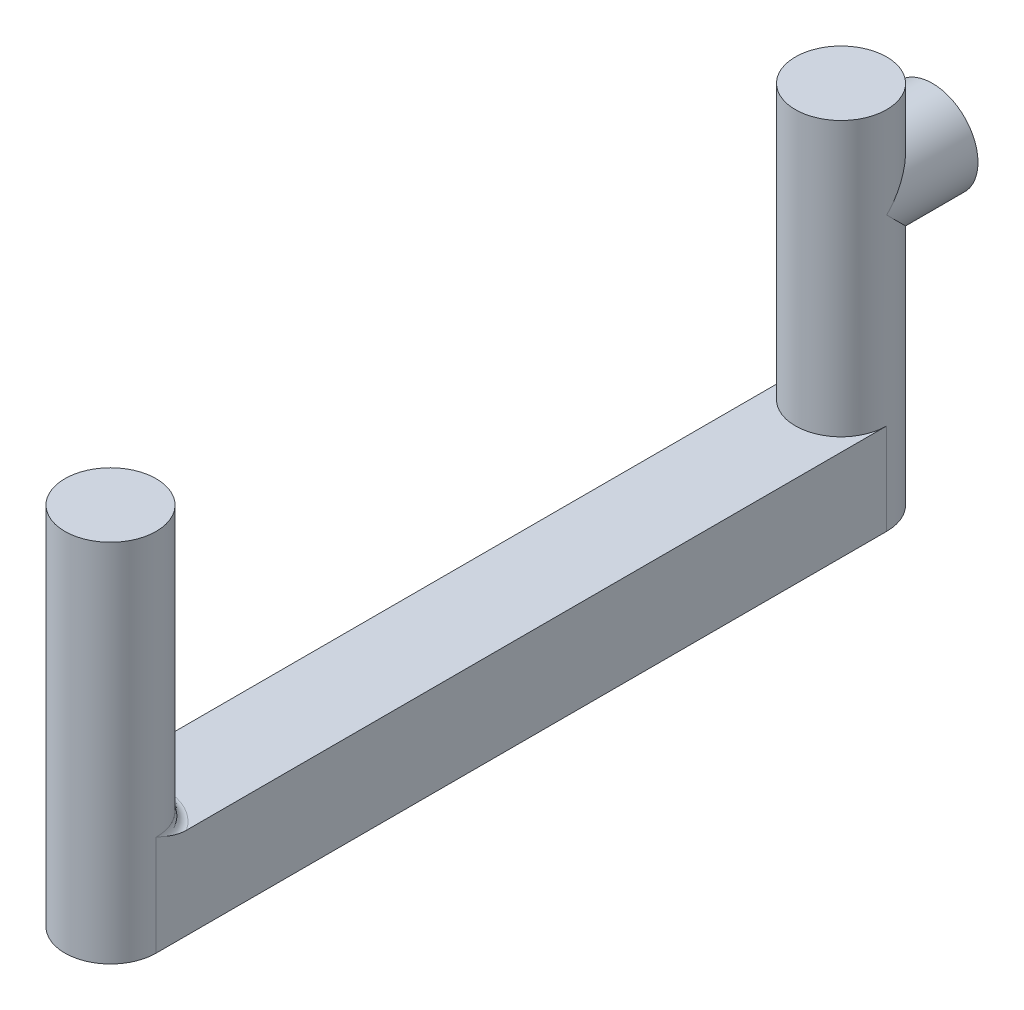
ISO-10303-21;
HEADER;
FILE_DESCRIPTION(('STEP AP214'),'2;1');
FILE_NAME('part.step','',(''),(''),'','','');
FILE_SCHEMA(('AUTOMOTIVE_DESIGN { 1 0 10303 214 1 1 1 1 }'));
ENDSEC;
DATA;
#1=APPLICATION_CONTEXT('core data for automotive mechanical design processes');
#2=APPLICATION_PROTOCOL_DEFINITION('international standard','automotive_design',2000,#1);
#3=PRODUCT_CONTEXT('',#1,'mechanical');
#4=PRODUCT('Part','Part','',(#3));
#5=PRODUCT_RELATED_PRODUCT_CATEGORY('part','',(#4));
#6=PRODUCT_DEFINITION_FORMATION('','',#4);
#7=PRODUCT_DEFINITION_CONTEXT('part definition',#1,'design');
#8=PRODUCT_DEFINITION('design','',#6,#7);
#9=PRODUCT_DEFINITION_SHAPE('','',#8);
#10=(LENGTH_UNIT() NAMED_UNIT(*) SI_UNIT(.MILLI.,.METRE.));
#11=(NAMED_UNIT(*) PLANE_ANGLE_UNIT() SI_UNIT($,.RADIAN.));
#12=(NAMED_UNIT(*) SI_UNIT($,.STERADIAN.) SOLID_ANGLE_UNIT());
#13=UNCERTAINTY_MEASURE_WITH_UNIT(LENGTH_MEASURE(1.E-05),#10,'distance_accuracy_value','');
#14=(GEOMETRIC_REPRESENTATION_CONTEXT(3) GLOBAL_UNCERTAINTY_ASSIGNED_CONTEXT((#13)) GLOBAL_UNIT_ASSIGNED_CONTEXT((#10,
#11,#12)) REPRESENTATION_CONTEXT('',''));
#15=CARTESIAN_POINT('',(0.,0.,0.));
#16=DIRECTION('',(0.,0.,1.));
#17=DIRECTION('',(1.,0.,0.));
#18=AXIS2_PLACEMENT_3D('',#15,#16,#17);
#19=CARTESIAN_POINT('',(-2.5,5.,-20.));
#20=DIRECTION('',(1.,0.,0.));
#21=DIRECTION('',(0.,0.,-1.));
#22=AXIS2_PLACEMENT_3D('',#19,#20,#21);
#23=PLANE('',#22);
#24=DIRECTION('',(0.,0.,1.));
#25=VECTOR('',#24,1.);
#26=CARTESIAN_POINT('',(-2.5,0.,-20.));
#27=LINE('',#26,#25);
#28=CARTESIAN_POINT('',(-2.5,0.,-40.));
#29=VERTEX_POINT('',#28);
#30=CARTESIAN_POINT('',(-2.5,0.,0.));
#31=VERTEX_POINT('',#30);
#32=EDGE_CURVE('E177',#29,#31,#27,.T.);
#33=ORIENTED_EDGE('',*,*,#32,.T.);
#34=DIRECTION('',(0.,-1.,0.));
#35=VECTOR('',#34,1.);
#36=CARTESIAN_POINT('',(-2.50000000000001,5.,0.));
#37=LINE('',#36,#35);
#38=CARTESIAN_POINT('',(-2.50000000000001,5.5,0.));
#39=VERTEX_POINT('',#38);
#40=EDGE_CURVE('E197',#39,#31,#37,.T.);
#41=ORIENTED_EDGE('',*,*,#40,.F.);
#42=CARTESIAN_POINT('',(-2.50000000000001,5.,-1.65831239517769));
#43=CARTESIAN_POINT('',(-2.50000000000001,5.00000367234763,-1.62747254784485));
#44=CARTESIAN_POINT('',(-2.50000000000001,5.00087130713419,-1.59664508344904));
#45=CARTESIAN_POINT('',(-2.50000000000001,5.00416032586069,-1.53508977619119));
#46=CARTESIAN_POINT('',(-2.50000000000001,5.0065808020371,-1.50436188566087));
#47=CARTESIAN_POINT('',(-2.50000000000001,5.01589374758323,-1.41256761932562));
#48=CARTESIAN_POINT('',(-2.50000000000001,5.02483983809621,-1.35170708495959));
#49=CARTESIAN_POINT('',(-2.50000000000001,5.04698039614975,-1.23148771776759));
#50=CARTESIAN_POINT('',(-2.50000000000001,5.06012725366667,-1.17211973797087));
#51=CARTESIAN_POINT('',(-2.50000000000001,5.08984859501445,-1.05420780272541));
#52=CARTESIAN_POINT('',(-2.50000000000001,5.10642593540756,-0.995664577722187));
#53=CARTESIAN_POINT('',(-2.50000000000001,5.1488906535687,-0.85798844070081));
#54=CARTESIAN_POINT('',(-2.50000000000001,5.17595705779363,-0.779222968830752));
#55=CARTESIAN_POINT('',(-2.5,5.23362988623079,-0.622988657203729));
#56=CARTESIAN_POINT('',(-2.5,5.264237791513,-0.545520375553017));
#57=CARTESIAN_POINT('',(-2.50000000000001,5.35959765696385,-0.314108487196937));
#58=CARTESIAN_POINT('',(-2.50000000000005,5.42773788802144,-0.161586098072096));
#59=CARTESIAN_POINT('',(-2.5,5.49727836354941,-0.00608579527811067));
#60=CARTESIAN_POINT('',(-2.5,5.4986391916918,-0.00304289195044444));
#61=CARTESIAN_POINT('',(-2.5,5.5,0.));
#62=B_SPLINE_CURVE_WITH_KNOTS('',3,(#42,#43,#44,#45,#46,#47,#48,#49,#50,#51,#52,#53,#54,#55,#56,
#57,#58,#59,#60,#61),.UNSPECIFIED.,.F.,.F.,(4,2,2,2,2,2,2,2,2,4),(0.,0.0924881922127617,
0.184922366674182,0.369242223874817,0.551543047197971,0.733996287657057,0.983724157697842,
1.23355684500701,1.73457859788814,1.7445785978882),.UNSPECIFIED.);
#63=CARTESIAN_POINT('',(-2.50000000000001,5.,-1.65831239517769));
#64=VERTEX_POINT('',#63);
#65=EDGE_CURVE('E95',#39,#64,#62,.F.);
#66=ORIENTED_EDGE('',*,*,#65,.T.);
#67=DIRECTION('',(0.,0.,1.));
#68=VECTOR('',#67,1.);
#69=CARTESIAN_POINT('',(-2.5,5.,-20.));
#70=LINE('',#69,#68);
#71=CARTESIAN_POINT('',(-2.5,5.,-40.));
#72=VERTEX_POINT('',#71);
#73=EDGE_CURVE('E180',#72,#64,#70,.T.);
#74=ORIENTED_EDGE('',*,*,#73,.F.);
#75=DIRECTION('',(0.,-1.,0.));
#76=VECTOR('',#75,1.);
#77=CARTESIAN_POINT('',(-2.50000000000001,5.,-40.));
#78=LINE('',#77,#76);
#79=EDGE_CURVE('E164',#72,#29,#78,.T.);
#80=ORIENTED_EDGE('',*,*,#79,.T.);
#81=EDGE_LOOP('',(#33,#41,#66,#74,#80));
#82=FACE_BOUND('',#81,.T.);
#83=ADVANCED_FACE('F39',(#82),#23,.F.);
#84=CARTESIAN_POINT('',(2.5,5.,-20.));
#85=DIRECTION('',(-1.,0.,0.));
#86=DIRECTION('',(0.,0.,1.));
#87=AXIS2_PLACEMENT_3D('',#84,#85,#86);
#88=PLANE('',#87);
#89=DIRECTION('',(0.,0.,-1.));
#90=VECTOR('',#89,1.);
#91=CARTESIAN_POINT('',(2.5,0.,-20.));
#92=LINE('',#91,#90);
#93=CARTESIAN_POINT('',(2.5,0.,0.));
#94=VERTEX_POINT('',#93);
#95=CARTESIAN_POINT('',(2.50000000000001,0.,-40.));
#96=VERTEX_POINT('',#95);
#97=EDGE_CURVE('E185',#94,#96,#92,.T.);
#98=ORIENTED_EDGE('',*,*,#97,.T.);
#99=DIRECTION('',(0.,-1.,0.));
#100=VECTOR('',#99,1.);
#101=CARTESIAN_POINT('',(2.50000000000001,5.,-40.));
#102=LINE('',#101,#100);
#103=CARTESIAN_POINT('',(2.5,5.,-40.));
#104=VERTEX_POINT('',#103);
#105=EDGE_CURVE('E168',#104,#96,#102,.T.);
#106=ORIENTED_EDGE('',*,*,#105,.F.);
#107=DIRECTION('',(0.,0.,-1.));
#108=VECTOR('',#107,1.);
#109=CARTESIAN_POINT('',(2.5,5.,-20.));
#110=LINE('',#109,#108);
#111=CARTESIAN_POINT('',(2.50000000000001,5.,-1.65831239517769));
#112=VERTEX_POINT('',#111);
#113=EDGE_CURVE('E184',#112,#104,#110,.T.);
#114=ORIENTED_EDGE('',*,*,#113,.F.);
#115=CARTESIAN_POINT('',(2.50000000000001,5.,-1.65831239517769));
#116=CARTESIAN_POINT('',(2.50000000000001,5.00000367234763,-1.62747254784485));
#117=CARTESIAN_POINT('',(2.50000000000001,5.00087130713419,-1.59664508344904));
#118=CARTESIAN_POINT('',(2.50000000000001,5.00416032586069,-1.53508977619119));
#119=CARTESIAN_POINT('',(2.50000000000001,5.0065808020371,-1.50436188566087));
#120=CARTESIAN_POINT('',(2.50000000000001,5.01589374758323,-1.41256761932562));
#121=CARTESIAN_POINT('',(2.50000000000001,5.02483983809621,-1.35170708495958));
#122=CARTESIAN_POINT('',(2.50000000000001,5.04698039614975,-1.23148771776759));
#123=CARTESIAN_POINT('',(2.50000000000001,5.06012725366667,-1.17211973797087));
#124=CARTESIAN_POINT('',(2.50000000000001,5.08984859501445,-1.05420780272541));
#125=CARTESIAN_POINT('',(2.50000000000001,5.10642593540756,-0.995664577722187));
#126=CARTESIAN_POINT('',(2.50000000000001,5.1488906535687,-0.85798844070081));
#127=CARTESIAN_POINT('',(2.50000000000001,5.17595705779363,-0.779222968830752));
#128=CARTESIAN_POINT('',(2.5,5.23362988623079,-0.622988657203729));
#129=CARTESIAN_POINT('',(2.5,5.264237791513,-0.545520375553017));
#130=CARTESIAN_POINT('',(2.50000000000001,5.35959765696385,-0.314108487196939));
#131=CARTESIAN_POINT('',(2.50000000000005,5.42773788802146,-0.161586098072104));
#132=CARTESIAN_POINT('',(2.5,5.49727836354941,-0.00608579527811081));
#133=CARTESIAN_POINT('',(2.5,5.4986391916918,-0.0030428919504443));
#134=CARTESIAN_POINT('',(2.5,5.5,0.));
#135=B_SPLINE_CURVE_WITH_KNOTS('',3,(#115,#116,#117,#118,#119,#120,#121,#122,#123,#124,#125,
#126,#127,#128,#129,#130,#131,#132,#133,#134),.UNSPECIFIED.,.F.,.F.,(4,2,2,2,2,2,2,2,2,4),(0.,
0.0924881922127626,0.184922366674183,0.36924222387482,0.551543047197972,0.733996287657056,
0.983724157697841,1.23355684500701,1.73457859788814,1.7445785978882),.UNSPECIFIED.);
#136=CARTESIAN_POINT('',(2.5,5.5,0.));
#137=VERTEX_POINT('',#136);
#138=EDGE_CURVE('E97',#112,#137,#135,.T.);
#139=ORIENTED_EDGE('',*,*,#138,.T.);
#140=DIRECTION('',(0.,-1.,0.));
#141=VECTOR('',#140,1.);
#142=CARTESIAN_POINT('',(2.50000000000001,5.,0.));
#143=LINE('',#142,#141);
#144=EDGE_CURVE('E61',#137,#94,#143,.T.);
#145=ORIENTED_EDGE('',*,*,#144,.T.);
#146=EDGE_LOOP('',(#98,#106,#114,#139,#145));
#147=FACE_BOUND('',#146,.T.);
#148=ADVANCED_FACE('F112',(#147),#88,.F.);
#149=CARTESIAN_POINT('',(0.,5.,0.));
#150=DIRECTION('',(0.,1.,0.));
#151=DIRECTION('',(0.,0.,1.));
#152=AXIS2_PLACEMENT_3D('',#149,#150,#151);
#153=PLANE('',#152);
#154=CARTESIAN_POINT('',(0.,5.,-40.));
#155=DIRECTION('',(0.,1.,0.));
#156=DIRECTION('',(0.,0.,1.));
#157=AXIS2_PLACEMENT_3D('',#154,#155,#156);
#158=CIRCLE('',#157,2.5);
#159=EDGE_CURVE('E160',#72,#104,#158,.T.);
#160=ORIENTED_EDGE('',*,*,#159,.F.);
#161=ORIENTED_EDGE('',*,*,#73,.T.);
#162=CARTESIAN_POINT('',(0.,5.,0.));
#163=DIRECTION('',(0.,1.,0.));
#164=DIRECTION('',(0.,0.,1.));
#165=AXIS2_PLACEMENT_3D('',#162,#163,#164);
#166=CIRCLE('',#165,3.);
#167=EDGE_CURVE('E200',#64,#112,#166,.F.);
#168=ORIENTED_EDGE('',*,*,#167,.T.);
#169=ORIENTED_EDGE('',*,*,#113,.T.);
#170=EDGE_LOOP('',(#160,#161,#168,#169));
#171=FACE_BOUND('',#170,.T.);
#172=ADVANCED_FACE('F117',(#171),#153,.T.);
#173=CARTESIAN_POINT('',(0.,0.,0.));
#174=DIRECTION('',(0.,1.,0.));
#175=DIRECTION('',(0.,0.,1.));
#176=AXIS2_PLACEMENT_3D('',#173,#174,#175);
#177=PLANE('',#176);
#178=ORIENTED_EDGE('',*,*,#32,.F.);
#179=CARTESIAN_POINT('',(0.,0.,-40.));
#180=DIRECTION('',(0.,-1.,0.));
#181=DIRECTION('',(0.,0.,-1.));
#182=AXIS2_PLACEMENT_3D('',#179,#180,#181);
#183=CIRCLE('',#182,2.5);
#184=EDGE_CURVE('E152',#29,#96,#183,.T.);
#185=ORIENTED_EDGE('',*,*,#184,.T.);
#186=ORIENTED_EDGE('',*,*,#97,.F.);
#187=CARTESIAN_POINT('',(0.,0.,0.));
#188=DIRECTION('',(0.,1.,0.));
#189=DIRECTION('',(0.,0.,1.));
#190=AXIS2_PLACEMENT_3D('',#187,#188,#189);
#191=CIRCLE('',#190,2.5);
#192=EDGE_CURVE('E172',#31,#94,#191,.T.);
#193=ORIENTED_EDGE('',*,*,#192,.F.);
#194=EDGE_LOOP('',(#178,#185,#186,#193));
#195=FACE_BOUND('',#194,.T.);
#196=ADVANCED_FACE('F119',(#195),#177,.F.);
#197=CARTESIAN_POINT('',(0.,20.,0.));
#198=DIRECTION('',(0.,-1.,0.));
#199=DIRECTION('',(0.,0.,-1.));
#200=AXIS2_PLACEMENT_3D('',#197,#198,#199);
#201=CYLINDRICAL_SURFACE('',#200,2.5);
#202=CARTESIAN_POINT('',(0.,20.,0.));
#203=DIRECTION('',(0.,1.,0.));
#204=DIRECTION('',(0.,0.,1.));
#205=AXIS2_PLACEMENT_3D('',#202,#203,#204);
#206=CIRCLE('',#205,2.5);
#207=CARTESIAN_POINT('',(0.,20.,2.5));
#208=VERTEX_POINT('',#207);
#209=EDGE_CURVE('E173',#208,#208,#206,.T.);
#210=ORIENTED_EDGE('',*,*,#209,.F.);
#211=EDGE_LOOP('',(#210));
#212=FACE_BOUND('',#211,.T.);
#213=ORIENTED_EDGE('',*,*,#144,.F.);
#214=CARTESIAN_POINT('',(0.,5.5,0.));
#215=DIRECTION('',(0.,1.,0.));
#216=DIRECTION('',(0.,0.,1.));
#217=AXIS2_PLACEMENT_3D('',#214,#215,#216);
#218=CIRCLE('',#217,2.5);
#219=EDGE_CURVE('E203',#137,#39,#218,.T.);
#220=ORIENTED_EDGE('',*,*,#219,.T.);
#221=ORIENTED_EDGE('',*,*,#40,.T.);
#222=ORIENTED_EDGE('',*,*,#192,.T.);
#223=EDGE_LOOP('',(#213,#220,#221,#222));
#224=FACE_BOUND('',#223,.T.);
#225=ADVANCED_FACE('F122',(#212,#224),#201,.T.);
#226=CARTESIAN_POINT('',(0.,20.,0.));
#227=DIRECTION('',(0.,1.,0.));
#228=DIRECTION('',(0.,0.,1.));
#229=AXIS2_PLACEMENT_3D('',#226,#227,#228);
#230=PLANE('',#229);
#231=ORIENTED_EDGE('',*,*,#209,.T.);
#232=EDGE_LOOP('',(#231));
#233=FACE_BOUND('',#232,.T.);
#234=ADVANCED_FACE('F129',(#233),#230,.T.);
#235=CARTESIAN_POINT('',(0.,5.5,0.));
#236=DIRECTION('',(0.,1.,0.));
#237=DIRECTION('',(0.,0.,1.));
#238=AXIS2_PLACEMENT_3D('',#235,#236,#237);
#239=TOROIDAL_SURFACE('',#238,3.,0.5);
#240=ORIENTED_EDGE('',*,*,#65,.F.);
#241=ORIENTED_EDGE('',*,*,#219,.F.);
#242=ORIENTED_EDGE('',*,*,#138,.F.);
#243=ORIENTED_EDGE('',*,*,#167,.F.);
#244=EDGE_LOOP('',(#240,#241,#242,#243));
#245=FACE_BOUND('',#244,.T.);
#246=ADVANCED_FACE('F41',(#245),#239,.F.);
#247=CARTESIAN_POINT('',(0.,20.,-40.));
#248=DIRECTION('',(0.,-1.,0.));
#249=DIRECTION('',(0.,0.,-1.));
#250=AXIS2_PLACEMENT_3D('',#247,#248,#249);
#251=CYLINDRICAL_SURFACE('',#250,2.5);
#252=CARTESIAN_POINT('',(0.,15.,-40.));
#253=DIRECTION('',(0.,-0.707106781186547,0.707106781186547));
#254=DIRECTION('',(0.,-0.707106781186547,-0.707106781186547));
#255=AXIS2_PLACEMENT_3D('',#252,#253,#254);
#256=ELLIPSE('',#255,3.53553390593274,2.5);
#257=CARTESIAN_POINT('',(2.5,15.,-40.));
#258=VERTEX_POINT('',#257);
#259=CARTESIAN_POINT('',(-2.5,15.,-40.));
#260=VERTEX_POINT('',#259);
#261=EDGE_CURVE('E11',#258,#260,#256,.F.);
#262=ORIENTED_EDGE('',*,*,#261,.F.);
#263=CARTESIAN_POINT('',(0.,15.,-40.));
#264=DIRECTION('',(0.,-0.707106781186547,-0.707106781186547));
#265=DIRECTION('',(0.,-0.707106781186547,0.707106781186547));
#266=AXIS2_PLACEMENT_3D('',#263,#264,#265);
#267=ELLIPSE('',#266,3.53553390593274,2.5);
#268=EDGE_CURVE('E49',#260,#258,#267,.T.);
#269=ORIENTED_EDGE('',*,*,#268,.F.);
#270=EDGE_LOOP('',(#262,#269));
#271=FACE_BOUND('',#270,.T.);
#272=CARTESIAN_POINT('',(0.,20.,-40.));
#273=DIRECTION('',(0.,-1.,0.));
#274=DIRECTION('',(0.,0.,-1.));
#275=AXIS2_PLACEMENT_3D('',#272,#273,#274);
#276=CIRCLE('',#275,2.5);
#277=CARTESIAN_POINT('',(0.,20.,-42.5));
#278=VERTEX_POINT('',#277);
#279=EDGE_CURVE('E155',#278,#278,#276,.T.);
#280=ORIENTED_EDGE('',*,*,#279,.T.);
#281=EDGE_LOOP('',(#280));
#282=FACE_BOUND('',#281,.T.);
#283=ORIENTED_EDGE('',*,*,#159,.T.);
#284=ORIENTED_EDGE('',*,*,#105,.T.);
#285=ORIENTED_EDGE('',*,*,#184,.F.);
#286=ORIENTED_EDGE('',*,*,#79,.F.);
#287=EDGE_LOOP('',(#283,#284,#285,#286));
#288=FACE_BOUND('',#287,.T.);
#289=ADVANCED_FACE('F90',(#271,#282,#288),#251,.T.);
#290=CARTESIAN_POINT('',(0.,20.,-40.));
#291=DIRECTION('',(0.,1.,0.));
#292=DIRECTION('',(0.,0.,-1.));
#293=AXIS2_PLACEMENT_3D('',#290,#291,#292);
#294=PLANE('',#293);
#295=ORIENTED_EDGE('',*,*,#279,.F.);
#296=EDGE_LOOP('',(#295));
#297=FACE_BOUND('',#296,.T.);
#298=ADVANCED_FACE('F136',(#297),#294,.T.);
#299=CARTESIAN_POINT('',(0.,15.,-45.));
#300=DIRECTION('',(0.,0.,1.));
#301=DIRECTION('',(1.,0.,0.));
#302=AXIS2_PLACEMENT_3D('',#299,#300,#301);
#303=CYLINDRICAL_SURFACE('',#302,2.5);
#304=CARTESIAN_POINT('',(0.,15.,-45.));
#305=DIRECTION('',(0.,0.,1.));
#306=DIRECTION('',(1.,0.,0.));
#307=AXIS2_PLACEMENT_3D('',#304,#305,#306);
#308=CIRCLE('',#307,2.5);
#309=CARTESIAN_POINT('',(2.5,15.,-45.));
#310=VERTEX_POINT('',#309);
#311=EDGE_CURVE('E150',#310,#310,#308,.T.);
#312=ORIENTED_EDGE('',*,*,#311,.T.);
#313=EDGE_LOOP('',(#312));
#314=FACE_BOUND('',#313,.T.);
#315=ORIENTED_EDGE('',*,*,#268,.T.);
#316=ORIENTED_EDGE('',*,*,#261,.T.);
#317=EDGE_LOOP('',(#315,#316));
#318=FACE_BOUND('',#317,.T.);
#319=ADVANCED_FACE('F93',(#314,#318),#303,.T.);
#320=CARTESIAN_POINT('',(0.,15.,-45.));
#321=DIRECTION('',(0.,0.,1.));
#322=DIRECTION('',(1.,0.,0.));
#323=AXIS2_PLACEMENT_3D('',#320,#321,#322);
#324=PLANE('',#323);
#325=ORIENTED_EDGE('',*,*,#311,.F.);
#326=EDGE_LOOP('',(#325));
#327=FACE_BOUND('',#326,.T.);
#328=ADVANCED_FACE('F142',(#327),#324,.F.);
#329=CLOSED_SHELL('',(#83,#148,#172,#196,#225,#234,#246,#289,#298,#319,#328));
#330=MANIFOLD_SOLID_BREP('B2',#329);
#331=ADVANCED_BREP_SHAPE_REPRESENTATION('',(#18,#330),#14);
#332=SHAPE_DEFINITION_REPRESENTATION(#9,#331);
ENDSEC;
END-ISO-10303-21;
